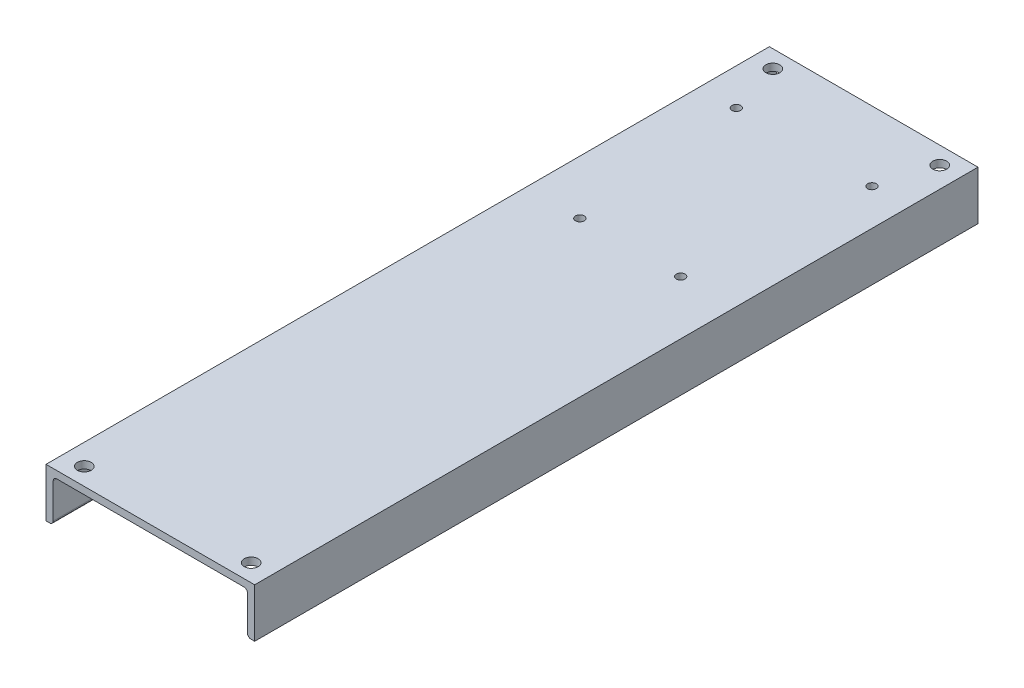
ISO-10303-21;
HEADER;
FILE_DESCRIPTION(('STEP AP214'),'2;1');
FILE_NAME('part.step','',(''),(''),'','','');
FILE_SCHEMA(('AUTOMOTIVE_DESIGN { 1 0 10303 214 1 1 1 1 }'));
ENDSEC;
DATA;
#1=APPLICATION_CONTEXT('core data for automotive mechanical design processes');
#2=APPLICATION_PROTOCOL_DEFINITION('international standard','automotive_design',2000,#1);
#3=PRODUCT_CONTEXT('',#1,'mechanical');
#4=PRODUCT('Part','Part','',(#3));
#5=PRODUCT_RELATED_PRODUCT_CATEGORY('part','',(#4));
#6=PRODUCT_DEFINITION_FORMATION('','',#4);
#7=PRODUCT_DEFINITION_CONTEXT('part definition',#1,'design');
#8=PRODUCT_DEFINITION('design','',#6,#7);
#9=PRODUCT_DEFINITION_SHAPE('','',#8);
#10=(LENGTH_UNIT() NAMED_UNIT(*) SI_UNIT(.MILLI.,.METRE.));
#11=(NAMED_UNIT(*) PLANE_ANGLE_UNIT() SI_UNIT($,.RADIAN.));
#12=(NAMED_UNIT(*) SI_UNIT($,.STERADIAN.) SOLID_ANGLE_UNIT());
#13=UNCERTAINTY_MEASURE_WITH_UNIT(LENGTH_MEASURE(1.E-05),#10,'distance_accuracy_value','');
#14=(GEOMETRIC_REPRESENTATION_CONTEXT(3) GLOBAL_UNCERTAINTY_ASSIGNED_CONTEXT((#13)) GLOBAL_UNIT_ASSIGNED_CONTEXT((#10,
#11,#12)) REPRESENTATION_CONTEXT('',''));
#15=CARTESIAN_POINT('',(0.,0.,0.));
#16=DIRECTION('',(0.,0.,1.));
#17=DIRECTION('',(1.,0.,0.));
#18=AXIS2_PLACEMENT_3D('',#15,#16,#17);
#19=CARTESIAN_POINT('',(0.,0.,1320.8));
#20=DIRECTION('',(1.,0.,0.));
#21=DIRECTION('',(0.,0.,-1.));
#22=AXIS2_PLACEMENT_3D('',#19,#20,#21);
#23=PLANE('',#22);
#24=DIRECTION('',(0.,-1.,0.));
#25=VECTOR('',#24,1.);
#26=CARTESIAN_POINT('',(0.,0.,0.));
#27=LINE('',#26,#25);
#28=CARTESIAN_POINT('',(0.,89.408,0.));
#29=VERTEX_POINT('',#28);
#30=CARTESIAN_POINT('',(0.,0.,0.));
#31=VERTEX_POINT('',#30);
#32=EDGE_CURVE('E152',#29,#31,#27,.T.);
#33=ORIENTED_EDGE('',*,*,#32,.T.);
#34=DIRECTION('',(0.,0.,-1.));
#35=VECTOR('',#34,1.);
#36=CARTESIAN_POINT('',(0.,0.,1320.8));
#37=LINE('',#36,#35);
#38=CARTESIAN_POINT('',(0.,0.,1320.8));
#39=VERTEX_POINT('',#38);
#40=EDGE_CURVE('E134',#39,#31,#37,.T.);
#41=ORIENTED_EDGE('',*,*,#40,.F.);
#42=DIRECTION('',(0.,-1.,0.));
#43=VECTOR('',#42,1.);
#44=CARTESIAN_POINT('',(0.,0.,1320.8));
#45=LINE('',#44,#43);
#46=CARTESIAN_POINT('',(0.,89.408,1320.8));
#47=VERTEX_POINT('',#46);
#48=EDGE_CURVE('E140',#47,#39,#45,.T.);
#49=ORIENTED_EDGE('',*,*,#48,.F.);
#50=DIRECTION('',(0.,0.,-1.));
#51=VECTOR('',#50,1.);
#52=CARTESIAN_POINT('',(0.,89.408,1320.8));
#53=LINE('',#52,#51);
#54=EDGE_CURVE('E220',#47,#29,#53,.T.);
#55=ORIENTED_EDGE('',*,*,#54,.T.);
#56=EDGE_LOOP('',(#33,#41,#49,#55));
#57=FACE_BOUND('',#56,.T.);
#58=ADVANCED_FACE('F39',(#57),#23,.F.);
#59=CARTESIAN_POINT('',(0.,0.,1320.8));
#60=DIRECTION('',(0.,1.,0.));
#61=DIRECTION('',(0.,0.,1.));
#62=AXIS2_PLACEMENT_3D('',#59,#60,#61);
#63=PLANE('',#62);
#64=DIRECTION('',(1.,0.,0.));
#65=VECTOR('',#64,1.);
#66=CARTESIAN_POINT('',(0.,0.,0.));
#67=LINE('',#66,#65);
#68=CARTESIAN_POINT('',(6.858,0.,0.));
#69=VERTEX_POINT('',#68);
#70=EDGE_CURVE('E222',#31,#69,#67,.T.);
#71=ORIENTED_EDGE('',*,*,#70,.T.);
#72=DIRECTION('',(0.,0.,-1.));
#73=VECTOR('',#72,1.);
#74=CARTESIAN_POINT('',(6.858,0.,1320.8));
#75=LINE('',#74,#73);
#76=CARTESIAN_POINT('',(6.858,0.,1320.8));
#77=VERTEX_POINT('',#76);
#78=EDGE_CURVE('E137',#69,#77,#75,.F.);
#79=ORIENTED_EDGE('',*,*,#78,.T.);
#80=DIRECTION('',(1.,0.,0.));
#81=VECTOR('',#80,1.);
#82=CARTESIAN_POINT('',(0.,0.,1320.8));
#83=LINE('',#82,#81);
#84=EDGE_CURVE('E129',#39,#77,#83,.T.);
#85=ORIENTED_EDGE('',*,*,#84,.F.);
#86=ORIENTED_EDGE('',*,*,#40,.T.);
#87=EDGE_LOOP('',(#71,#79,#85,#86));
#88=FACE_BOUND('',#87,.T.);
#89=ADVANCED_FACE('F132',(#88),#63,.F.);
#90=CARTESIAN_POINT('',(13.208,0.,1320.8));
#91=DIRECTION('',(-1.,0.,0.));
#92=DIRECTION('',(0.,-1.,0.));
#93=AXIS2_PLACEMENT_3D('',#90,#91,#92);
#94=PLANE('',#93);
#95=DIRECTION('',(0.,1.,0.));
#96=VECTOR('',#95,1.);
#97=CARTESIAN_POINT('',(13.208,0.,1320.8));
#98=LINE('',#97,#96);
#99=CARTESIAN_POINT('',(13.208,6.35,1320.8));
#100=VERTEX_POINT('',#99);
#101=CARTESIAN_POINT('',(13.208,69.85,1320.8));
#102=VERTEX_POINT('',#101);
#103=EDGE_CURVE('E139',#100,#102,#98,.T.);
#104=ORIENTED_EDGE('',*,*,#103,.F.);
#105=DIRECTION('',(0.,0.,-1.));
#106=VECTOR('',#105,1.);
#107=CARTESIAN_POINT('',(13.208,6.35,1320.8));
#108=LINE('',#107,#106);
#109=CARTESIAN_POINT('',(13.208,6.35,0.));
#110=VERTEX_POINT('',#109);
#111=EDGE_CURVE('E156',#100,#110,#108,.T.);
#112=ORIENTED_EDGE('',*,*,#111,.T.);
#113=DIRECTION('',(0.,1.,0.));
#114=VECTOR('',#113,1.);
#115=CARTESIAN_POINT('',(13.208,0.,0.));
#116=LINE('',#115,#114);
#117=CARTESIAN_POINT('',(13.208,69.85,0.));
#118=VERTEX_POINT('',#117);
#119=EDGE_CURVE('E204',#110,#118,#116,.T.);
#120=ORIENTED_EDGE('',*,*,#119,.T.);
#121=DIRECTION('',(0.,0.,-1.));
#122=VECTOR('',#121,1.);
#123=CARTESIAN_POINT('',(13.208,69.85,1320.8));
#124=LINE('',#123,#122);
#125=EDGE_CURVE('E153',#118,#102,#124,.F.);
#126=ORIENTED_EDGE('',*,*,#125,.T.);
#127=EDGE_LOOP('',(#104,#112,#120,#126));
#128=FACE_BOUND('',#127,.T.);
#129=ADVANCED_FACE('F249',(#128),#94,.F.);
#130=CARTESIAN_POINT('',(13.208,76.2,1320.8));
#131=DIRECTION('',(0.,1.,0.));
#132=DIRECTION('',(0.,0.,1.));
#133=AXIS2_PLACEMENT_3D('',#130,#131,#132);
#134=PLANE('',#133);
#135=CARTESIAN_POINT('',(342.9,76.2,31.75));
#136=DIRECTION('',(0.,1.,0.));
#137=DIRECTION('',(0.,0.,1.));
#138=AXIS2_PLACEMENT_3D('',#135,#136,#137);
#139=CIRCLE('',#138,12.7);
#140=CARTESIAN_POINT('',(342.9,76.2,44.45));
#141=VERTEX_POINT('',#140);
#142=EDGE_CURVE('E285',#141,#141,#139,.F.);
#143=ORIENTED_EDGE('',*,*,#142,.F.);
#144=EDGE_LOOP('',(#143));
#145=FACE_BOUND('',#144,.T.);
#146=CARTESIAN_POINT('',(38.1000000000002,76.2,1289.05));
#147=DIRECTION('',(0.,1.,0.));
#148=DIRECTION('',(0.,0.,1.));
#149=AXIS2_PLACEMENT_3D('',#146,#147,#148);
#150=CIRCLE('',#149,12.7);
#151=CARTESIAN_POINT('',(38.1000000000002,76.2,1301.75));
#152=VERTEX_POINT('',#151);
#153=EDGE_CURVE('E286',#152,#152,#150,.F.);
#154=ORIENTED_EDGE('',*,*,#153,.F.);
#155=EDGE_LOOP('',(#154));
#156=FACE_BOUND('',#155,.T.);
#157=CARTESIAN_POINT('',(342.9,76.2,1289.05));
#158=DIRECTION('',(0.,1.,0.));
#159=DIRECTION('',(0.,0.,1.));
#160=AXIS2_PLACEMENT_3D('',#157,#158,#159);
#161=CIRCLE('',#160,12.7);
#162=CARTESIAN_POINT('',(342.9,76.2,1301.75));
#163=VERTEX_POINT('',#162);
#164=EDGE_CURVE('E296',#163,#163,#161,.F.);
#165=ORIENTED_EDGE('',*,*,#164,.F.);
#166=EDGE_LOOP('',(#165));
#167=FACE_BOUND('',#166,.T.);
#168=CARTESIAN_POINT('',(38.1,76.2,31.75));
#169=DIRECTION('',(0.,1.,0.));
#170=DIRECTION('',(0.,0.,1.));
#171=AXIS2_PLACEMENT_3D('',#168,#169,#170);
#172=CIRCLE('',#171,12.7);
#173=CARTESIAN_POINT('',(38.1,76.2,44.45));
#174=VERTEX_POINT('',#173);
#175=EDGE_CURVE('E271',#174,#174,#172,.F.);
#176=ORIENTED_EDGE('',*,*,#175,.F.);
#177=EDGE_LOOP('',(#176));
#178=FACE_BOUND('',#177,.T.);
#179=CARTESIAN_POINT('',(66.675,76.2,127.));
#180=DIRECTION('',(0.,1.,0.));
#181=DIRECTION('',(0.,0.,1.));
#182=AXIS2_PLACEMENT_3D('',#179,#180,#181);
#183=CIRCLE('',#182,7.93749999999998);
#184=CARTESIAN_POINT('',(66.675,76.2,134.9375));
#185=VERTEX_POINT('',#184);
#186=EDGE_CURVE('E223',#185,#185,#183,.F.);
#187=ORIENTED_EDGE('',*,*,#186,.F.);
#188=EDGE_LOOP('',(#187));
#189=FACE_BOUND('',#188,.T.);
#190=CARTESIAN_POINT('',(282.575,76.2,444.5));
#191=DIRECTION('',(0.,1.,0.));
#192=DIRECTION('',(0.,0.,1.));
#193=AXIS2_PLACEMENT_3D('',#190,#191,#192);
#194=CIRCLE('',#193,7.93749999999998);
#195=CARTESIAN_POINT('',(282.575,76.2,452.4375));
#196=VERTEX_POINT('',#195);
#197=EDGE_CURVE('E268',#196,#196,#194,.F.);
#198=ORIENTED_EDGE('',*,*,#197,.F.);
#199=EDGE_LOOP('',(#198));
#200=FACE_BOUND('',#199,.T.);
#201=CARTESIAN_POINT('',(98.425,76.2,444.5));
#202=DIRECTION('',(0.,1.,0.));
#203=DIRECTION('',(0.,0.,1.));
#204=AXIS2_PLACEMENT_3D('',#201,#202,#203);
#205=CIRCLE('',#204,7.93749999999998);
#206=CARTESIAN_POINT('',(98.425,76.2,452.4375));
#207=VERTEX_POINT('',#206);
#208=EDGE_CURVE('E256',#207,#207,#205,.F.);
#209=ORIENTED_EDGE('',*,*,#208,.F.);
#210=EDGE_LOOP('',(#209));
#211=FACE_BOUND('',#210,.T.);
#212=CARTESIAN_POINT('',(314.325,76.2,127.));
#213=DIRECTION('',(0.,1.,0.));
#214=DIRECTION('',(0.,0.,1.));
#215=AXIS2_PLACEMENT_3D('',#212,#213,#214);
#216=CIRCLE('',#215,7.93749999999998);
#217=CARTESIAN_POINT('',(314.325,76.2,134.9375));
#218=VERTEX_POINT('',#217);
#219=EDGE_CURVE('E255',#218,#218,#216,.F.);
#220=ORIENTED_EDGE('',*,*,#219,.F.);
#221=EDGE_LOOP('',(#220));
#222=FACE_BOUND('',#221,.T.);
#223=DIRECTION('',(1.,0.,0.));
#224=VECTOR('',#223,1.);
#225=CARTESIAN_POINT('',(13.208,76.2,1320.8));
#226=LINE('',#225,#224);
#227=CARTESIAN_POINT('',(19.558,76.2,1320.8));
#228=VERTEX_POINT('',#227);
#229=CARTESIAN_POINT('',(361.442,76.2,1320.8));
#230=VERTEX_POINT('',#229);
#231=EDGE_CURVE('E209',#228,#230,#226,.T.);
#232=ORIENTED_EDGE('',*,*,#231,.F.);
#233=DIRECTION('',(0.,0.,-1.));
#234=VECTOR('',#233,1.);
#235=CARTESIAN_POINT('',(19.558,76.2,0.));
#236=LINE('',#235,#234);
#237=CARTESIAN_POINT('',(19.558,76.2,0.));
#238=VERTEX_POINT('',#237);
#239=EDGE_CURVE('E175',#228,#238,#236,.T.);
#240=ORIENTED_EDGE('',*,*,#239,.T.);
#241=DIRECTION('',(1.,0.,0.));
#242=VECTOR('',#241,1.);
#243=CARTESIAN_POINT('',(13.208,76.2,0.));
#244=LINE('',#243,#242);
#245=CARTESIAN_POINT('',(361.442,76.2,0.));
#246=VERTEX_POINT('',#245);
#247=EDGE_CURVE('E194',#238,#246,#244,.T.);
#248=ORIENTED_EDGE('',*,*,#247,.T.);
#249=DIRECTION('',(0.,0.,-1.));
#250=VECTOR('',#249,1.);
#251=CARTESIAN_POINT('',(361.442,76.2,1320.8));
#252=LINE('',#251,#250);
#253=EDGE_CURVE('E173',#246,#230,#252,.F.);
#254=ORIENTED_EDGE('',*,*,#253,.T.);
#255=EDGE_LOOP('',(#232,#240,#248,#254));
#256=FACE_BOUND('',#255,.T.);
#257=ADVANCED_FACE('F201',(#145,#156,#167,#178,#189,#200,#211,#222,#256),#134,.F.);
#258=CARTESIAN_POINT('',(367.792,0.,1320.8));
#259=DIRECTION('',(1.,0.,0.));
#260=DIRECTION('',(0.,0.,-1.));
#261=AXIS2_PLACEMENT_3D('',#258,#259,#260);
#262=PLANE('',#261);
#263=DIRECTION('',(0.,-1.,0.));
#264=VECTOR('',#263,1.);
#265=CARTESIAN_POINT('',(367.792,0.,1320.8));
#266=LINE('',#265,#264);
#267=CARTESIAN_POINT('',(367.792,69.85,1320.8));
#268=VERTEX_POINT('',#267);
#269=CARTESIAN_POINT('',(367.792,6.35,1320.8));
#270=VERTEX_POINT('',#269);
#271=EDGE_CURVE('E208',#268,#270,#266,.T.);
#272=ORIENTED_EDGE('',*,*,#271,.F.);
#273=DIRECTION('',(0.,0.,-1.));
#274=VECTOR('',#273,1.);
#275=CARTESIAN_POINT('',(367.792,69.85,0.));
#276=LINE('',#275,#274);
#277=CARTESIAN_POINT('',(367.792,69.85,0.));
#278=VERTEX_POINT('',#277);
#279=EDGE_CURVE('E179',#268,#278,#276,.T.);
#280=ORIENTED_EDGE('',*,*,#279,.T.);
#281=DIRECTION('',(0.,-1.,0.));
#282=VECTOR('',#281,1.);
#283=CARTESIAN_POINT('',(367.792,0.,0.));
#284=LINE('',#283,#282);
#285=CARTESIAN_POINT('',(367.792,6.35,0.));
#286=VERTEX_POINT('',#285);
#287=EDGE_CURVE('E195',#278,#286,#284,.T.);
#288=ORIENTED_EDGE('',*,*,#287,.T.);
#289=DIRECTION('',(0.,0.,-1.));
#290=VECTOR('',#289,1.);
#291=CARTESIAN_POINT('',(367.792,6.35,1320.8));
#292=LINE('',#291,#290);
#293=EDGE_CURVE('E62',#286,#270,#292,.F.);
#294=ORIENTED_EDGE('',*,*,#293,.T.);
#295=EDGE_LOOP('',(#272,#280,#288,#294));
#296=FACE_BOUND('',#295,.T.);
#297=ADVANCED_FACE('F210',(#296),#262,.F.);
#298=CARTESIAN_POINT('',(367.792,0.,1320.8));
#299=DIRECTION('',(0.,1.,0.));
#300=DIRECTION('',(0.,0.,1.));
#301=AXIS2_PLACEMENT_3D('',#298,#299,#300);
#302=PLANE('',#301);
#303=DIRECTION('',(1.,0.,0.));
#304=VECTOR('',#303,1.);
#305=CARTESIAN_POINT('',(367.792,0.,1320.8));
#306=LINE('',#305,#304);
#307=CARTESIAN_POINT('',(374.142,0.,1320.8));
#308=VERTEX_POINT('',#307);
#309=CARTESIAN_POINT('',(381.,0.,1320.8));
#310=VERTEX_POINT('',#309);
#311=EDGE_CURVE('E211',#308,#310,#306,.T.);
#312=ORIENTED_EDGE('',*,*,#311,.F.);
#313=DIRECTION('',(0.,0.,-1.));
#314=VECTOR('',#313,1.);
#315=CARTESIAN_POINT('',(374.142,0.,1320.8));
#316=LINE('',#315,#314);
#317=CARTESIAN_POINT('',(374.142,0.,0.));
#318=VERTEX_POINT('',#317);
#319=EDGE_CURVE('E182',#308,#318,#316,.T.);
#320=ORIENTED_EDGE('',*,*,#319,.T.);
#321=DIRECTION('',(1.,0.,0.));
#322=VECTOR('',#321,1.);
#323=CARTESIAN_POINT('',(367.792,0.,0.));
#324=LINE('',#323,#322);
#325=CARTESIAN_POINT('',(381.,0.,0.));
#326=VERTEX_POINT('',#325);
#327=EDGE_CURVE('E228',#318,#326,#324,.T.);
#328=ORIENTED_EDGE('',*,*,#327,.T.);
#329=DIRECTION('',(0.,0.,-1.));
#330=VECTOR('',#329,1.);
#331=CARTESIAN_POINT('',(381.,0.,1320.8));
#332=LINE('',#331,#330);
#333=EDGE_CURVE('E154',#310,#326,#332,.T.);
#334=ORIENTED_EDGE('',*,*,#333,.F.);
#335=EDGE_LOOP('',(#312,#320,#328,#334));
#336=FACE_BOUND('',#335,.T.);
#337=ADVANCED_FACE('F457',(#336),#302,.F.);
#338=CARTESIAN_POINT('',(381.,0.,1320.8));
#339=DIRECTION('',(-1.,0.,0.));
#340=DIRECTION('',(0.,0.,1.));
#341=AXIS2_PLACEMENT_3D('',#338,#339,#340);
#342=PLANE('',#341);
#343=DIRECTION('',(0.,1.,0.));
#344=VECTOR('',#343,1.);
#345=CARTESIAN_POINT('',(381.,0.,0.));
#346=LINE('',#345,#344);
#347=CARTESIAN_POINT('',(381.,89.408,0.));
#348=VERTEX_POINT('',#347);
#349=EDGE_CURVE('E230',#326,#348,#346,.T.);
#350=ORIENTED_EDGE('',*,*,#349,.T.);
#351=DIRECTION('',(0.,0.,-1.));
#352=VECTOR('',#351,1.);
#353=CARTESIAN_POINT('',(381.,89.408,1320.8));
#354=LINE('',#353,#352);
#355=CARTESIAN_POINT('',(381.,89.408,1320.8));
#356=VERTEX_POINT('',#355);
#357=EDGE_CURVE('E159',#356,#348,#354,.T.);
#358=ORIENTED_EDGE('',*,*,#357,.F.);
#359=DIRECTION('',(0.,1.,0.));
#360=VECTOR('',#359,1.);
#361=CARTESIAN_POINT('',(381.,0.,1320.8));
#362=LINE('',#361,#360);
#363=EDGE_CURVE('E213',#310,#356,#362,.T.);
#364=ORIENTED_EDGE('',*,*,#363,.F.);
#365=ORIENTED_EDGE('',*,*,#333,.T.);
#366=EDGE_LOOP('',(#350,#358,#364,#365));
#367=FACE_BOUND('',#366,.T.);
#368=ADVANCED_FACE('F434',(#367),#342,.F.);
#369=CARTESIAN_POINT('',(0.,89.408,1320.8));
#370=DIRECTION('',(0.,-1.,0.));
#371=DIRECTION('',(0.,0.,-1.));
#372=AXIS2_PLACEMENT_3D('',#369,#370,#371);
#373=PLANE('',#372);
#374=CARTESIAN_POINT('',(342.9,89.408,31.75));
#375=DIRECTION('',(0.,1.,0.));
#376=DIRECTION('',(0.,0.,1.));
#377=AXIS2_PLACEMENT_3D('',#374,#375,#376);
#378=CIRCLE('',#377,12.7);
#379=CARTESIAN_POINT('',(342.9,89.408,44.45));
#380=VERTEX_POINT('',#379);
#381=EDGE_CURVE('E281',#380,#380,#378,.T.);
#382=ORIENTED_EDGE('',*,*,#381,.F.);
#383=EDGE_LOOP('',(#382));
#384=FACE_BOUND('',#383,.T.);
#385=CARTESIAN_POINT('',(38.1000000000002,89.408,1289.05));
#386=DIRECTION('',(0.,1.,0.));
#387=DIRECTION('',(0.,0.,1.));
#388=AXIS2_PLACEMENT_3D('',#385,#386,#387);
#389=CIRCLE('',#388,12.7);
#390=CARTESIAN_POINT('',(38.1000000000002,89.408,1301.75));
#391=VERTEX_POINT('',#390);
#392=EDGE_CURVE('E282',#391,#391,#389,.T.);
#393=ORIENTED_EDGE('',*,*,#392,.F.);
#394=EDGE_LOOP('',(#393));
#395=FACE_BOUND('',#394,.T.);
#396=CARTESIAN_POINT('',(342.9,89.408,1289.05));
#397=DIRECTION('',(0.,1.,0.));
#398=DIRECTION('',(0.,0.,1.));
#399=AXIS2_PLACEMENT_3D('',#396,#397,#398);
#400=CIRCLE('',#399,12.7);
#401=CARTESIAN_POINT('',(342.9,89.408,1301.75));
#402=VERTEX_POINT('',#401);
#403=EDGE_CURVE('E289',#402,#402,#400,.T.);
#404=ORIENTED_EDGE('',*,*,#403,.F.);
#405=EDGE_LOOP('',(#404));
#406=FACE_BOUND('',#405,.T.);
#407=CARTESIAN_POINT('',(38.1,89.408,31.75));
#408=DIRECTION('',(0.,1.,0.));
#409=DIRECTION('',(0.,0.,1.));
#410=AXIS2_PLACEMENT_3D('',#407,#408,#409);
#411=CIRCLE('',#410,12.7);
#412=CARTESIAN_POINT('',(38.1,89.408,44.45));
#413=VERTEX_POINT('',#412);
#414=EDGE_CURVE('E278',#413,#413,#411,.T.);
#415=ORIENTED_EDGE('',*,*,#414,.F.);
#416=EDGE_LOOP('',(#415));
#417=FACE_BOUND('',#416,.T.);
#418=CARTESIAN_POINT('',(66.675,89.408,127.));
#419=DIRECTION('',(0.,1.,0.));
#420=DIRECTION('',(0.,0.,1.));
#421=AXIS2_PLACEMENT_3D('',#418,#419,#420);
#422=CIRCLE('',#421,7.93749999999998);
#423=CARTESIAN_POINT('',(66.675,89.408,134.9375));
#424=VERTEX_POINT('',#423);
#425=EDGE_CURVE('E263',#424,#424,#422,.T.);
#426=ORIENTED_EDGE('',*,*,#425,.F.);
#427=EDGE_LOOP('',(#426));
#428=FACE_BOUND('',#427,.T.);
#429=CARTESIAN_POINT('',(282.575,89.408,444.5));
#430=DIRECTION('',(0.,1.,0.));
#431=DIRECTION('',(0.,0.,1.));
#432=AXIS2_PLACEMENT_3D('',#429,#430,#431);
#433=CIRCLE('',#432,7.93749999999998);
#434=CARTESIAN_POINT('',(282.575,89.408,452.4375));
#435=VERTEX_POINT('',#434);
#436=EDGE_CURVE('E259',#435,#435,#433,.T.);
#437=ORIENTED_EDGE('',*,*,#436,.F.);
#438=EDGE_LOOP('',(#437));
#439=FACE_BOUND('',#438,.T.);
#440=CARTESIAN_POINT('',(98.425,89.408,444.5));
#441=DIRECTION('',(0.,1.,0.));
#442=DIRECTION('',(0.,0.,1.));
#443=AXIS2_PLACEMENT_3D('',#440,#441,#442);
#444=CIRCLE('',#443,7.93749999999998);
#445=CARTESIAN_POINT('',(98.425,89.408,452.4375));
#446=VERTEX_POINT('',#445);
#447=EDGE_CURVE('E252',#446,#446,#444,.T.);
#448=ORIENTED_EDGE('',*,*,#447,.F.);
#449=EDGE_LOOP('',(#448));
#450=FACE_BOUND('',#449,.T.);
#451=CARTESIAN_POINT('',(314.325,89.408,127.));
#452=DIRECTION('',(0.,1.,0.));
#453=DIRECTION('',(0.,0.,1.));
#454=AXIS2_PLACEMENT_3D('',#451,#452,#453);
#455=CIRCLE('',#454,7.93749999999998);
#456=CARTESIAN_POINT('',(314.325,89.408,134.9375));
#457=VERTEX_POINT('',#456);
#458=EDGE_CURVE('E260',#457,#457,#455,.T.);
#459=ORIENTED_EDGE('',*,*,#458,.F.);
#460=EDGE_LOOP('',(#459));
#461=FACE_BOUND('',#460,.T.);
#462=DIRECTION('',(-1.,0.,0.));
#463=VECTOR('',#462,1.);
#464=CARTESIAN_POINT('',(0.,89.408,0.));
#465=LINE('',#464,#463);
#466=EDGE_CURVE('E149',#348,#29,#465,.T.);
#467=ORIENTED_EDGE('',*,*,#466,.T.);
#468=ORIENTED_EDGE('',*,*,#54,.F.);
#469=DIRECTION('',(-1.,0.,0.));
#470=VECTOR('',#469,1.);
#471=CARTESIAN_POINT('',(0.,89.408,1320.8));
#472=LINE('',#471,#470);
#473=EDGE_CURVE('E145',#356,#47,#472,.T.);
#474=ORIENTED_EDGE('',*,*,#473,.F.);
#475=ORIENTED_EDGE('',*,*,#357,.T.);
#476=EDGE_LOOP('',(#467,#468,#474,#475));
#477=FACE_BOUND('',#476,.T.);
#478=ADVANCED_FACE('F237',(#384,#395,#406,#417,#428,#439,#450,#461,#477),#373,.F.);
#479=CARTESIAN_POINT('',(0.,0.,1320.8));
#480=DIRECTION('',(0.,0.,-1.));
#481=DIRECTION('',(-1.,0.,0.));
#482=AXIS2_PLACEMENT_3D('',#479,#480,#481);
#483=PLANE('',#482);
#484=ORIENTED_EDGE('',*,*,#84,.T.);
#485=CARTESIAN_POINT('',(6.858,6.35,1320.8));
#486=DIRECTION('',(0.,0.,-1.));
#487=DIRECTION('',(-1.,0.,0.));
#488=AXIS2_PLACEMENT_3D('',#485,#486,#487);
#489=CIRCLE('',#488,6.35);
#490=EDGE_CURVE('E171',#77,#100,#489,.F.);
#491=ORIENTED_EDGE('',*,*,#490,.T.);
#492=ORIENTED_EDGE('',*,*,#103,.T.);
#493=CARTESIAN_POINT('',(19.558,69.85,1320.8));
#494=DIRECTION('',(0.,0.,-1.));
#495=DIRECTION('',(-1.,0.,0.));
#496=AXIS2_PLACEMENT_3D('',#493,#494,#495);
#497=CIRCLE('',#496,6.35);
#498=EDGE_CURVE('E187',#102,#228,#497,.T.);
#499=ORIENTED_EDGE('',*,*,#498,.T.);
#500=ORIENTED_EDGE('',*,*,#231,.T.);
#501=CARTESIAN_POINT('',(361.442,69.85,1320.8));
#502=DIRECTION('',(0.,0.,-1.));
#503=DIRECTION('',(-1.,0.,0.));
#504=AXIS2_PLACEMENT_3D('',#501,#502,#503);
#505=CIRCLE('',#504,6.35);
#506=EDGE_CURVE('E11',#230,#268,#505,.T.);
#507=ORIENTED_EDGE('',*,*,#506,.T.);
#508=ORIENTED_EDGE('',*,*,#271,.T.);
#509=CARTESIAN_POINT('',(374.142,6.35,1320.8));
#510=DIRECTION('',(0.,0.,-1.));
#511=DIRECTION('',(-1.,0.,0.));
#512=AXIS2_PLACEMENT_3D('',#509,#510,#511);
#513=CIRCLE('',#512,6.35);
#514=EDGE_CURVE('E54',#270,#308,#513,.F.);
#515=ORIENTED_EDGE('',*,*,#514,.T.);
#516=ORIENTED_EDGE('',*,*,#311,.T.);
#517=ORIENTED_EDGE('',*,*,#363,.T.);
#518=ORIENTED_EDGE('',*,*,#473,.T.);
#519=ORIENTED_EDGE('',*,*,#48,.T.);
#520=EDGE_LOOP('',(#484,#491,#492,#499,#500,#507,#508,#515,#516,#517,#518,#519));
#521=FACE_BOUND('',#520,.T.);
#522=ADVANCED_FACE('F143',(#521),#483,.F.);
#523=CARTESIAN_POINT('',(0.,0.,0.));
#524=DIRECTION('',(0.,0.,-1.));
#525=DIRECTION('',(-1.,0.,0.));
#526=AXIS2_PLACEMENT_3D('',#523,#524,#525);
#527=PLANE('',#526);
#528=ORIENTED_EDGE('',*,*,#119,.F.);
#529=CARTESIAN_POINT('',(6.858,6.35,0.));
#530=DIRECTION('',(0.,0.,-1.));
#531=DIRECTION('',(-1.,0.,0.));
#532=AXIS2_PLACEMENT_3D('',#529,#530,#531);
#533=CIRCLE('',#532,6.35);
#534=EDGE_CURVE('E167',#110,#69,#533,.T.);
#535=ORIENTED_EDGE('',*,*,#534,.T.);
#536=ORIENTED_EDGE('',*,*,#70,.F.);
#537=ORIENTED_EDGE('',*,*,#32,.F.);
#538=ORIENTED_EDGE('',*,*,#466,.F.);
#539=ORIENTED_EDGE('',*,*,#349,.F.);
#540=ORIENTED_EDGE('',*,*,#327,.F.);
#541=CARTESIAN_POINT('',(374.142,6.35,0.));
#542=DIRECTION('',(0.,0.,-1.));
#543=DIRECTION('',(-1.,0.,0.));
#544=AXIS2_PLACEMENT_3D('',#541,#542,#543);
#545=CIRCLE('',#544,6.35);
#546=EDGE_CURVE('E165',#318,#286,#545,.T.);
#547=ORIENTED_EDGE('',*,*,#546,.T.);
#548=ORIENTED_EDGE('',*,*,#287,.F.);
#549=CARTESIAN_POINT('',(361.442,69.85,0.));
#550=DIRECTION('',(0.,0.,-1.));
#551=DIRECTION('',(-1.,0.,0.));
#552=AXIS2_PLACEMENT_3D('',#549,#550,#551);
#553=CIRCLE('',#552,6.35);
#554=EDGE_CURVE('E47',#278,#246,#553,.F.);
#555=ORIENTED_EDGE('',*,*,#554,.T.);
#556=ORIENTED_EDGE('',*,*,#247,.F.);
#557=CARTESIAN_POINT('',(19.558,69.85,0.));
#558=DIRECTION('',(0.,0.,-1.));
#559=DIRECTION('',(-1.,0.,0.));
#560=AXIS2_PLACEMENT_3D('',#557,#558,#559);
#561=CIRCLE('',#560,6.35);
#562=EDGE_CURVE('E185',#238,#118,#561,.F.);
#563=ORIENTED_EDGE('',*,*,#562,.T.);
#564=EDGE_LOOP('',(#528,#535,#536,#537,#538,#539,#540,#547,#548,#555,#556,#563));
#565=FACE_BOUND('',#564,.T.);
#566=ADVANCED_FACE('F193',(#565),#527,.T.);
#567=CARTESIAN_POINT('',(6.858,6.35,1320.8));
#568=DIRECTION('',(0.,0.,-1.));
#569=DIRECTION('',(-1.,0.,0.));
#570=AXIS2_PLACEMENT_3D('',#567,#568,#569);
#571=CYLINDRICAL_SURFACE('',#570,6.35);
#572=ORIENTED_EDGE('',*,*,#490,.F.);
#573=ORIENTED_EDGE('',*,*,#78,.F.);
#574=ORIENTED_EDGE('',*,*,#534,.F.);
#575=ORIENTED_EDGE('',*,*,#111,.F.);
#576=EDGE_LOOP('',(#572,#573,#574,#575));
#577=FACE_BOUND('',#576,.T.);
#578=ADVANCED_FACE('F243',(#577),#571,.T.);
#579=CARTESIAN_POINT('',(19.558,69.85,1320.8));
#580=DIRECTION('',(0.,0.,1.));
#581=DIRECTION('',(1.,0.,0.));
#582=AXIS2_PLACEMENT_3D('',#579,#580,#581);
#583=CYLINDRICAL_SURFACE('',#582,6.35);
#584=ORIENTED_EDGE('',*,*,#498,.F.);
#585=ORIENTED_EDGE('',*,*,#125,.F.);
#586=ORIENTED_EDGE('',*,*,#562,.F.);
#587=ORIENTED_EDGE('',*,*,#239,.F.);
#588=EDGE_LOOP('',(#584,#585,#586,#587));
#589=FACE_BOUND('',#588,.T.);
#590=ADVANCED_FACE('F341',(#589),#583,.F.);
#591=CARTESIAN_POINT('',(361.442,69.85,1320.8));
#592=DIRECTION('',(0.,0.,1.));
#593=DIRECTION('',(1.,0.,0.));
#594=AXIS2_PLACEMENT_3D('',#591,#592,#593);
#595=CYLINDRICAL_SURFACE('',#594,6.35);
#596=ORIENTED_EDGE('',*,*,#506,.F.);
#597=ORIENTED_EDGE('',*,*,#253,.F.);
#598=ORIENTED_EDGE('',*,*,#554,.F.);
#599=ORIENTED_EDGE('',*,*,#279,.F.);
#600=EDGE_LOOP('',(#596,#597,#598,#599));
#601=FACE_BOUND('',#600,.T.);
#602=ADVANCED_FACE('F207',(#601),#595,.F.);
#603=CARTESIAN_POINT('',(374.142,6.35,1320.8));
#604=DIRECTION('',(0.,0.,-1.));
#605=DIRECTION('',(-1.,0.,0.));
#606=AXIS2_PLACEMENT_3D('',#603,#604,#605);
#607=CYLINDRICAL_SURFACE('',#606,6.35);
#608=ORIENTED_EDGE('',*,*,#514,.F.);
#609=ORIENTED_EDGE('',*,*,#293,.F.);
#610=ORIENTED_EDGE('',*,*,#546,.F.);
#611=ORIENTED_EDGE('',*,*,#319,.F.);
#612=EDGE_LOOP('',(#608,#609,#610,#611));
#613=FACE_BOUND('',#612,.T.);
#614=ADVANCED_FACE('F41',(#613),#607,.T.);
#615=CARTESIAN_POINT('',(314.325,-0.001000000000001,127.));
#616=DIRECTION('',(0.,1.,0.));
#617=DIRECTION('',(0.,0.,1.));
#618=AXIS2_PLACEMENT_3D('',#615,#616,#617);
#619=CYLINDRICAL_SURFACE('',#618,7.93749999999998);
#620=ORIENTED_EDGE('',*,*,#458,.T.);
#621=EDGE_LOOP('',(#620));
#622=FACE_BOUND('',#621,.T.);
#623=ORIENTED_EDGE('',*,*,#219,.T.);
#624=EDGE_LOOP('',(#623));
#625=FACE_BOUND('',#624,.T.);
#626=ADVANCED_FACE('F316',(#622,#625),#619,.F.);
#627=CARTESIAN_POINT('',(98.425,-0.001000000000001,444.5));
#628=DIRECTION('',(0.,1.,0.));
#629=DIRECTION('',(0.,0.,1.));
#630=AXIS2_PLACEMENT_3D('',#627,#628,#629);
#631=CYLINDRICAL_SURFACE('',#630,7.93749999999998);
#632=ORIENTED_EDGE('',*,*,#447,.T.);
#633=EDGE_LOOP('',(#632));
#634=FACE_BOUND('',#633,.T.);
#635=ORIENTED_EDGE('',*,*,#208,.T.);
#636=EDGE_LOOP('',(#635));
#637=FACE_BOUND('',#636,.T.);
#638=ADVANCED_FACE('F318',(#634,#637),#631,.F.);
#639=CARTESIAN_POINT('',(282.575,-0.001000000000001,444.5));
#640=DIRECTION('',(0.,1.,0.));
#641=DIRECTION('',(0.,0.,1.));
#642=AXIS2_PLACEMENT_3D('',#639,#640,#641);
#643=CYLINDRICAL_SURFACE('',#642,7.93749999999998);
#644=ORIENTED_EDGE('',*,*,#436,.T.);
#645=EDGE_LOOP('',(#644));
#646=FACE_BOUND('',#645,.T.);
#647=ORIENTED_EDGE('',*,*,#197,.T.);
#648=EDGE_LOOP('',(#647));
#649=FACE_BOUND('',#648,.T.);
#650=ADVANCED_FACE('F325',(#646,#649),#643,.F.);
#651=CARTESIAN_POINT('',(66.675,-0.001000000000001,127.));
#652=DIRECTION('',(0.,1.,0.));
#653=DIRECTION('',(0.,0.,1.));
#654=AXIS2_PLACEMENT_3D('',#651,#652,#653);
#655=CYLINDRICAL_SURFACE('',#654,7.93749999999998);
#656=ORIENTED_EDGE('',*,*,#425,.T.);
#657=EDGE_LOOP('',(#656));
#658=FACE_BOUND('',#657,.T.);
#659=ORIENTED_EDGE('',*,*,#186,.T.);
#660=EDGE_LOOP('',(#659));
#661=FACE_BOUND('',#660,.T.);
#662=ADVANCED_FACE('F374',(#658,#661),#655,.F.);
#663=CARTESIAN_POINT('',(38.1,-0.001000000000001,31.75));
#664=DIRECTION('',(0.,1.,0.));
#665=DIRECTION('',(0.,0.,1.));
#666=AXIS2_PLACEMENT_3D('',#663,#664,#665);
#667=CYLINDRICAL_SURFACE('',#666,12.7);
#668=ORIENTED_EDGE('',*,*,#414,.T.);
#669=EDGE_LOOP('',(#668));
#670=FACE_BOUND('',#669,.T.);
#671=ORIENTED_EDGE('',*,*,#175,.T.);
#672=EDGE_LOOP('',(#671));
#673=FACE_BOUND('',#672,.T.);
#674=ADVANCED_FACE('F383',(#670,#673),#667,.F.);
#675=CARTESIAN_POINT('',(342.9,-0.001000000000001,1289.05));
#676=DIRECTION('',(0.,1.,0.));
#677=DIRECTION('',(0.,0.,1.));
#678=AXIS2_PLACEMENT_3D('',#675,#676,#677);
#679=CYLINDRICAL_SURFACE('',#678,12.7);
#680=ORIENTED_EDGE('',*,*,#403,.T.);
#681=EDGE_LOOP('',(#680));
#682=FACE_BOUND('',#681,.T.);
#683=ORIENTED_EDGE('',*,*,#164,.T.);
#684=EDGE_LOOP('',(#683));
#685=FACE_BOUND('',#684,.T.);
#686=ADVANCED_FACE('F300',(#682,#685),#679,.F.);
#687=CARTESIAN_POINT('',(38.1000000000002,-0.001000000000001,1289.05));
#688=DIRECTION('',(0.,1.,0.));
#689=DIRECTION('',(0.,0.,1.));
#690=AXIS2_PLACEMENT_3D('',#687,#688,#689);
#691=CYLINDRICAL_SURFACE('',#690,12.7);
#692=ORIENTED_EDGE('',*,*,#392,.T.);
#693=EDGE_LOOP('',(#692));
#694=FACE_BOUND('',#693,.T.);
#695=ORIENTED_EDGE('',*,*,#153,.T.);
#696=EDGE_LOOP('',(#695));
#697=FACE_BOUND('',#696,.T.);
#698=ADVANCED_FACE('F403',(#694,#697),#691,.F.);
#699=CARTESIAN_POINT('',(342.9,-0.001000000000001,31.75));
#700=DIRECTION('',(0.,1.,0.));
#701=DIRECTION('',(0.,0.,1.));
#702=AXIS2_PLACEMENT_3D('',#699,#700,#701);
#703=CYLINDRICAL_SURFACE('',#702,12.7);
#704=ORIENTED_EDGE('',*,*,#381,.T.);
#705=EDGE_LOOP('',(#704));
#706=FACE_BOUND('',#705,.T.);
#707=ORIENTED_EDGE('',*,*,#142,.T.);
#708=EDGE_LOOP('',(#707));
#709=FACE_BOUND('',#708,.T.);
#710=ADVANCED_FACE('F413',(#706,#709),#703,.F.);
#711=CLOSED_SHELL('',(#58,#89,#129,#257,#297,#337,#368,#478,#522,#566,#578,#590,#602,#614,#626,
#638,#650,#662,#674,#686,#698,#710));
#712=MANIFOLD_SOLID_BREP('B2',#711);
#713=ADVANCED_BREP_SHAPE_REPRESENTATION('',(#18,#712),#14);
#714=SHAPE_DEFINITION_REPRESENTATION(#9,#713);
ENDSEC;
END-ISO-10303-21;
